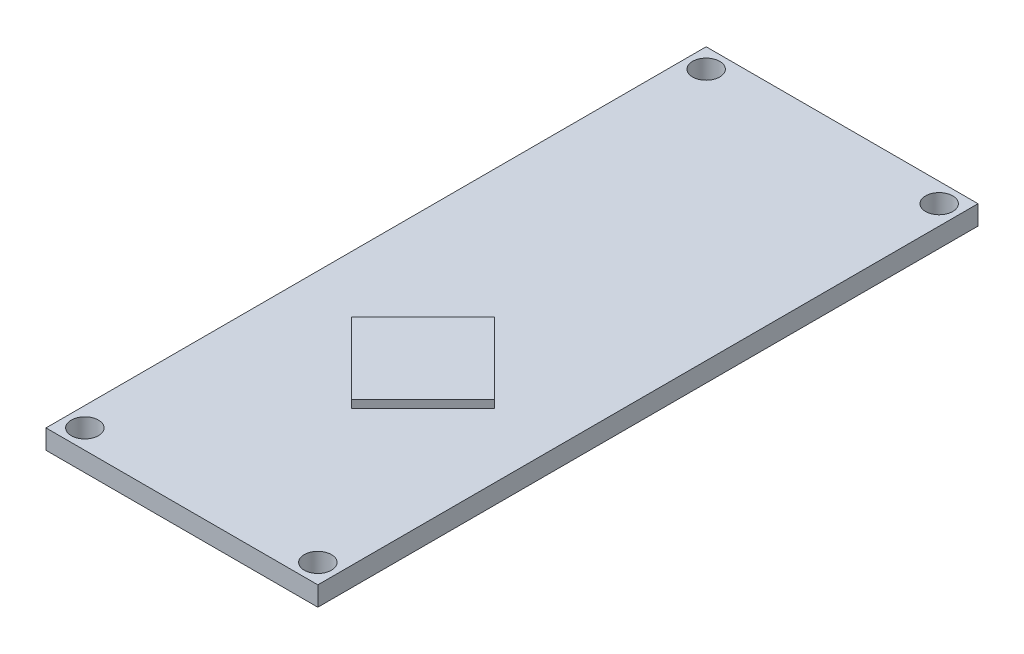
ISO-10303-21;
HEADER;
FILE_DESCRIPTION(('STEP AP214'),'2;1');
FILE_NAME('part.step','',(''),(''),'','','');
FILE_SCHEMA(('AUTOMOTIVE_DESIGN { 1 0 10303 214 1 1 1 1 }'));
ENDSEC;
DATA;
#1=APPLICATION_CONTEXT('core data for automotive mechanical design processes');
#2=APPLICATION_PROTOCOL_DEFINITION('international standard','automotive_design',2000,#1);
#3=PRODUCT_CONTEXT('',#1,'mechanical');
#4=PRODUCT('Part','Part','',(#3));
#5=PRODUCT_RELATED_PRODUCT_CATEGORY('part','',(#4));
#6=PRODUCT_DEFINITION_FORMATION('','',#4);
#7=PRODUCT_DEFINITION_CONTEXT('part definition',#1,'design');
#8=PRODUCT_DEFINITION('design','',#6,#7);
#9=PRODUCT_DEFINITION_SHAPE('','',#8);
#10=(LENGTH_UNIT() NAMED_UNIT(*) SI_UNIT(.MILLI.,.METRE.));
#11=(NAMED_UNIT(*) PLANE_ANGLE_UNIT() SI_UNIT($,.RADIAN.));
#12=(NAMED_UNIT(*) SI_UNIT($,.STERADIAN.) SOLID_ANGLE_UNIT());
#13=UNCERTAINTY_MEASURE_WITH_UNIT(LENGTH_MEASURE(1.E-05),#10,'distance_accuracy_value','');
#14=(GEOMETRIC_REPRESENTATION_CONTEXT(3) GLOBAL_UNCERTAINTY_ASSIGNED_CONTEXT((#13)) GLOBAL_UNIT_ASSIGNED_CONTEXT((#10,
#11,#12)) REPRESENTATION_CONTEXT('',''));
#15=CARTESIAN_POINT('',(0.,0.,0.));
#16=DIRECTION('',(0.,0.,1.));
#17=DIRECTION('',(1.,0.,0.));
#18=AXIS2_PLACEMENT_3D('',#15,#16,#17);
#19=CARTESIAN_POINT('',(0.,-0.508,0.));
#20=DIRECTION('',(0.,-1.,0.));
#21=DIRECTION('',(0.,0.,-1.));
#22=AXIS2_PLACEMENT_3D('',#19,#20,#21);
#23=PLANE('',#22);
#24=DIRECTION('',(0.,0.,-1.));
#25=VECTOR('',#24,1.);
#26=CARTESIAN_POINT('',(5.50663911064166,-0.508,-10.114599275795));
#27=LINE('',#26,#25);
#28=CARTESIAN_POINT('',(5.50663911064166,-0.508,-10.114599275795));
#29=VERTEX_POINT('',#28);
#30=CARTESIAN_POINT('',(5.50663911064166,-0.508,-13.018407240233));
#31=VERTEX_POINT('',#30);
#32=EDGE_CURVE('E130',#29,#31,#27,.T.);
#33=ORIENTED_EDGE('',*,*,#32,.F.);
#34=DIRECTION('',(1.,0.,0.));
#35=VECTOR('',#34,1.);
#36=CARTESIAN_POINT('',(-0.500613615789437,-0.508,-10.114599275795));
#37=LINE('',#36,#35);
#38=CARTESIAN_POINT('',(-0.500613615789437,-0.508,-10.114599275795));
#39=VERTEX_POINT('',#38);
#40=EDGE_CURVE('E127',#39,#29,#37,.T.);
#41=ORIENTED_EDGE('',*,*,#40,.F.);
#42=DIRECTION('',(0.,0.,1.));
#43=VECTOR('',#42,1.);
#44=CARTESIAN_POINT('',(-0.500613615789437,-0.508,-10.114599275795));
#45=LINE('',#44,#43);
#46=CARTESIAN_POINT('',(-0.500613615789437,-0.508,-13.018407240233));
#47=VERTEX_POINT('',#46);
#48=EDGE_CURVE('E144',#47,#39,#45,.T.);
#49=ORIENTED_EDGE('',*,*,#48,.F.);
#50=DIRECTION('',(-1.,0.,0.));
#51=VECTOR('',#50,1.);
#52=CARTESIAN_POINT('',(-0.500613615789437,-0.508,-13.018407240233));
#53=LINE('',#52,#51);
#54=EDGE_CURVE('E133',#31,#47,#53,.T.);
#55=ORIENTED_EDGE('',*,*,#54,.F.);
#56=EDGE_LOOP('',(#33,#41,#49,#55));
#57=FACE_BOUND('',#56,.T.);
#58=ADVANCED_FACE('F16',(#57),#23,.T.);
#59=CARTESIAN_POINT('',(0.,-0.508,0.));
#60=DIRECTION('',(0.,-1.,0.));
#61=DIRECTION('',(0.,0.,-1.));
#62=AXIS2_PLACEMENT_3D('',#59,#60,#61);
#63=PLANE('',#62);
#64=DIRECTION('',(0.,0.,-1.));
#65=VECTOR('',#64,1.);
#66=CARTESIAN_POINT('',(2.53466996138324,-0.508,16.2318082517412));
#67=LINE('',#66,#65);
#68=CARTESIAN_POINT('',(2.53466996138324,-0.508,16.2318082517412));
#69=VERTEX_POINT('',#68);
#70=CARTESIAN_POINT('',(2.53466996138324,-0.508,6.31387003138477));
#71=VERTEX_POINT('',#70);
#72=EDGE_CURVE('E228',#69,#71,#67,.T.);
#73=ORIENTED_EDGE('',*,*,#72,.F.);
#74=DIRECTION('',(1.,0.,0.));
#75=VECTOR('',#74,1.);
#76=CARTESIAN_POINT('',(-2.36452259621594,-0.508,16.2318082517412));
#77=LINE('',#76,#75);
#78=CARTESIAN_POINT('',(-2.36452259621594,-0.508,16.2318082517412));
#79=VERTEX_POINT('',#78);
#80=EDGE_CURVE('E225',#79,#69,#77,.T.);
#81=ORIENTED_EDGE('',*,*,#80,.F.);
#82=DIRECTION('',(0.,0.,1.));
#83=VECTOR('',#82,1.);
#84=CARTESIAN_POINT('',(-2.36452259621594,-0.508,16.2318082517412));
#85=LINE('',#84,#83);
#86=CARTESIAN_POINT('',(-2.36452259621594,-0.508,6.31387003138477));
#87=VERTEX_POINT('',#86);
#88=EDGE_CURVE('E219',#87,#79,#85,.T.);
#89=ORIENTED_EDGE('',*,*,#88,.F.);
#90=DIRECTION('',(-1.,0.,0.));
#91=VECTOR('',#90,1.);
#92=CARTESIAN_POINT('',(-2.36452259621594,-0.508,6.31387003138477));
#93=LINE('',#92,#91);
#94=EDGE_CURVE('E211',#71,#87,#93,.T.);
#95=ORIENTED_EDGE('',*,*,#94,.F.);
#96=EDGE_LOOP('',(#73,#81,#89,#95));
#97=FACE_BOUND('',#96,.T.);
#98=ADVANCED_FACE('F489',(#97),#63,.T.);
#99=CARTESIAN_POINT('',(5.50663911064166,-0.508,-10.114599275795));
#100=DIRECTION('',(1.,0.,0.));
#101=DIRECTION('',(0.,0.,-1.));
#102=AXIS2_PLACEMENT_3D('',#99,#100,#101);
#103=PLANE('',#102);
#104=ORIENTED_EDGE('',*,*,#32,.T.);
#105=DIRECTION('',(0.,1.,0.));
#106=VECTOR('',#105,1.);
#107=CARTESIAN_POINT('',(5.50663911064166,-0.508,-13.018407240233));
#108=LINE('',#107,#106);
#109=CARTESIAN_POINT('',(5.50663911064166,0.,-13.018407240233));
#110=VERTEX_POINT('',#109);
#111=EDGE_CURVE('E234',#110,#31,#108,.F.);
#112=ORIENTED_EDGE('',*,*,#111,.F.);
#113=DIRECTION('',(0.,0.,1.));
#114=VECTOR('',#113,1.);
#115=CARTESIAN_POINT('',(5.50663911064166,0.,0.));
#116=LINE('',#115,#114);
#117=CARTESIAN_POINT('',(5.50663911064166,0.,-10.114599275795));
#118=VERTEX_POINT('',#117);
#119=EDGE_CURVE('E141',#110,#118,#116,.T.);
#120=ORIENTED_EDGE('',*,*,#119,.T.);
#121=DIRECTION('',(0.,1.,0.));
#122=VECTOR('',#121,1.);
#123=CARTESIAN_POINT('',(5.50663911064166,-0.508,-10.114599275795));
#124=LINE('',#123,#122);
#125=EDGE_CURVE('E138',#29,#118,#124,.T.);
#126=ORIENTED_EDGE('',*,*,#125,.F.);
#127=EDGE_LOOP('',(#104,#112,#120,#126));
#128=FACE_BOUND('',#127,.T.);
#129=ADVANCED_FACE('F139',(#128),#103,.T.);
#130=CARTESIAN_POINT('',(-0.500613615789437,-0.508,-10.114599275795));
#131=DIRECTION('',(0.,0.,1.));
#132=DIRECTION('',(1.,0.,0.));
#133=AXIS2_PLACEMENT_3D('',#130,#131,#132);
#134=PLANE('',#133);
#135=ORIENTED_EDGE('',*,*,#40,.T.);
#136=ORIENTED_EDGE('',*,*,#125,.T.);
#137=DIRECTION('',(1.,0.,0.));
#138=VECTOR('',#137,1.);
#139=CARTESIAN_POINT('',(0.,0.,-10.114599275795));
#140=LINE('',#139,#138);
#141=CARTESIAN_POINT('',(-0.500613615789437,0.,-10.114599275795));
#142=VERTEX_POINT('',#141);
#143=EDGE_CURVE('E206',#118,#142,#140,.F.);
#144=ORIENTED_EDGE('',*,*,#143,.T.);
#145=DIRECTION('',(0.,1.,0.));
#146=VECTOR('',#145,1.);
#147=CARTESIAN_POINT('',(-0.500613615789437,-0.508,-10.114599275795));
#148=LINE('',#147,#146);
#149=EDGE_CURVE('E148',#39,#142,#148,.T.);
#150=ORIENTED_EDGE('',*,*,#149,.F.);
#151=EDGE_LOOP('',(#135,#136,#144,#150));
#152=FACE_BOUND('',#151,.T.);
#153=ADVANCED_FACE('F146',(#152),#134,.T.);
#154=CARTESIAN_POINT('',(-0.500613615789437,-0.508,-10.114599275795));
#155=DIRECTION('',(-1.,0.,0.));
#156=DIRECTION('',(0.,0.,1.));
#157=AXIS2_PLACEMENT_3D('',#154,#155,#156);
#158=PLANE('',#157);
#159=ORIENTED_EDGE('',*,*,#48,.T.);
#160=ORIENTED_EDGE('',*,*,#149,.T.);
#161=DIRECTION('',(0.,0.,1.));
#162=VECTOR('',#161,1.);
#163=CARTESIAN_POINT('',(-0.500613615789437,0.,0.));
#164=LINE('',#163,#162);
#165=CARTESIAN_POINT('',(-0.500613615789437,0.,-13.018407240233));
#166=VERTEX_POINT('',#165);
#167=EDGE_CURVE('E204',#142,#166,#164,.F.);
#168=ORIENTED_EDGE('',*,*,#167,.T.);
#169=DIRECTION('',(0.,1.,0.));
#170=VECTOR('',#169,1.);
#171=CARTESIAN_POINT('',(-0.500613615789437,-0.508,-13.018407240233));
#172=LINE('',#171,#170);
#173=EDGE_CURVE('E230',#47,#166,#172,.T.);
#174=ORIENTED_EDGE('',*,*,#173,.F.);
#175=EDGE_LOOP('',(#159,#160,#168,#174));
#176=FACE_BOUND('',#175,.T.);
#177=ADVANCED_FACE('F238',(#176),#158,.T.);
#178=CARTESIAN_POINT('',(-0.500613615789437,-0.508,-13.018407240233));
#179=DIRECTION('',(0.,0.,-1.));
#180=DIRECTION('',(-1.,0.,0.));
#181=AXIS2_PLACEMENT_3D('',#178,#179,#180);
#182=PLANE('',#181);
#183=ORIENTED_EDGE('',*,*,#54,.T.);
#184=ORIENTED_EDGE('',*,*,#173,.T.);
#185=DIRECTION('',(1.,0.,0.));
#186=VECTOR('',#185,1.);
#187=CARTESIAN_POINT('',(0.,0.,-13.018407240233));
#188=LINE('',#187,#186);
#189=EDGE_CURVE('E201',#166,#110,#188,.T.);
#190=ORIENTED_EDGE('',*,*,#189,.T.);
#191=ORIENTED_EDGE('',*,*,#111,.T.);
#192=EDGE_LOOP('',(#183,#184,#190,#191));
#193=FACE_BOUND('',#192,.T.);
#194=ADVANCED_FACE('F242',(#193),#182,.T.);
#195=CARTESIAN_POINT('',(2.53466996138324,-0.508,16.2318082517412));
#196=DIRECTION('',(1.,0.,0.));
#197=DIRECTION('',(0.,0.,-1.));
#198=AXIS2_PLACEMENT_3D('',#195,#196,#197);
#199=PLANE('',#198);
#200=ORIENTED_EDGE('',*,*,#72,.T.);
#201=DIRECTION('',(0.,1.,0.));
#202=VECTOR('',#201,1.);
#203=CARTESIAN_POINT('',(2.53466996138324,-0.508,6.31387003138477));
#204=LINE('',#203,#202);
#205=CARTESIAN_POINT('',(2.53466996138324,0.,6.31387003138477));
#206=VERTEX_POINT('',#205);
#207=EDGE_CURVE('E214',#206,#71,#204,.F.);
#208=ORIENTED_EDGE('',*,*,#207,.F.);
#209=DIRECTION('',(0.,0.,1.));
#210=VECTOR('',#209,1.);
#211=CARTESIAN_POINT('',(2.53466996138324,0.,0.));
#212=LINE('',#211,#210);
#213=CARTESIAN_POINT('',(2.53466996138324,0.,16.2318082517412));
#214=VERTEX_POINT('',#213);
#215=EDGE_CURVE('E199',#206,#214,#212,.T.);
#216=ORIENTED_EDGE('',*,*,#215,.T.);
#217=DIRECTION('',(0.,1.,0.));
#218=VECTOR('',#217,1.);
#219=CARTESIAN_POINT('',(2.53466996138324,-0.508,16.2318082517412));
#220=LINE('',#219,#218);
#221=EDGE_CURVE('E222',#69,#214,#220,.T.);
#222=ORIENTED_EDGE('',*,*,#221,.F.);
#223=EDGE_LOOP('',(#200,#208,#216,#222));
#224=FACE_BOUND('',#223,.T.);
#225=ADVANCED_FACE('F446',(#224),#199,.T.);
#226=CARTESIAN_POINT('',(-2.36452259621594,-0.508,16.2318082517412));
#227=DIRECTION('',(0.,0.,1.));
#228=DIRECTION('',(1.,0.,0.));
#229=AXIS2_PLACEMENT_3D('',#226,#227,#228);
#230=PLANE('',#229);
#231=ORIENTED_EDGE('',*,*,#80,.T.);
#232=ORIENTED_EDGE('',*,*,#221,.T.);
#233=DIRECTION('',(1.,0.,0.));
#234=VECTOR('',#233,1.);
#235=CARTESIAN_POINT('',(0.,0.,16.2318082517412));
#236=LINE('',#235,#234);
#237=CARTESIAN_POINT('',(-2.36452259621594,0.,16.2318082517412));
#238=VERTEX_POINT('',#237);
#239=EDGE_CURVE('E194',#214,#238,#236,.F.);
#240=ORIENTED_EDGE('',*,*,#239,.T.);
#241=DIRECTION('',(0.,1.,0.));
#242=VECTOR('',#241,1.);
#243=CARTESIAN_POINT('',(-2.36452259621594,-0.508,16.2318082517412));
#244=LINE('',#243,#242);
#245=EDGE_CURVE('E216',#79,#238,#244,.T.);
#246=ORIENTED_EDGE('',*,*,#245,.F.);
#247=EDGE_LOOP('',(#231,#232,#240,#246));
#248=FACE_BOUND('',#247,.T.);
#249=ADVANCED_FACE('F436',(#248),#230,.T.);
#250=CARTESIAN_POINT('',(-2.36452259621594,-0.508,16.2318082517412));
#251=DIRECTION('',(-1.,0.,0.));
#252=DIRECTION('',(0.,0.,1.));
#253=AXIS2_PLACEMENT_3D('',#250,#251,#252);
#254=PLANE('',#253);
#255=ORIENTED_EDGE('',*,*,#88,.T.);
#256=ORIENTED_EDGE('',*,*,#245,.T.);
#257=DIRECTION('',(0.,0.,1.));
#258=VECTOR('',#257,1.);
#259=CARTESIAN_POINT('',(-2.36452259621594,0.,0.));
#260=LINE('',#259,#258);
#261=CARTESIAN_POINT('',(-2.36452259621594,0.,6.31387003138477));
#262=VERTEX_POINT('',#261);
#263=EDGE_CURVE('E187',#238,#262,#260,.F.);
#264=ORIENTED_EDGE('',*,*,#263,.T.);
#265=DIRECTION('',(0.,1.,0.));
#266=VECTOR('',#265,1.);
#267=CARTESIAN_POINT('',(-2.36452259621594,-0.508,6.31387003138477));
#268=LINE('',#267,#266);
#269=EDGE_CURVE('E209',#87,#262,#268,.T.);
#270=ORIENTED_EDGE('',*,*,#269,.F.);
#271=EDGE_LOOP('',(#255,#256,#264,#270));
#272=FACE_BOUND('',#271,.T.);
#273=ADVANCED_FACE('F258',(#272),#254,.T.);
#274=CARTESIAN_POINT('',(-2.36452259621594,-0.508,6.31387003138477));
#275=DIRECTION('',(0.,0.,-1.));
#276=DIRECTION('',(-1.,0.,0.));
#277=AXIS2_PLACEMENT_3D('',#274,#275,#276);
#278=PLANE('',#277);
#279=ORIENTED_EDGE('',*,*,#94,.T.);
#280=ORIENTED_EDGE('',*,*,#269,.T.);
#281=DIRECTION('',(1.,0.,0.));
#282=VECTOR('',#281,1.);
#283=CARTESIAN_POINT('',(0.,0.,6.31387003138477));
#284=LINE('',#283,#282);
#285=EDGE_CURVE('E183',#262,#206,#284,.T.);
#286=ORIENTED_EDGE('',*,*,#285,.T.);
#287=ORIENTED_EDGE('',*,*,#207,.T.);
#288=EDGE_LOOP('',(#279,#280,#286,#287));
#289=FACE_BOUND('',#288,.T.);
#290=ADVANCED_FACE('F247',(#289),#278,.T.);
#291=CARTESIAN_POINT('',(0.,0.,0.));
#292=DIRECTION('',(0.,1.,0.));
#293=DIRECTION('',(0.,0.,1.));
#294=AXIS2_PLACEMENT_3D('',#291,#292,#293);
#295=PLANE('',#294);
#296=CARTESIAN_POINT('',(7.62,0.,20.32));
#297=DIRECTION('',(0.,-1.,0.));
#298=DIRECTION('',(0.,0.,-1.));
#299=AXIS2_PLACEMENT_3D('',#296,#297,#298);
#300=CIRCLE('',#299,0.889000000000001);
#301=CARTESIAN_POINT('',(7.62,0.,19.431));
#302=VERTEX_POINT('',#301);
#303=EDGE_CURVE('E168',#302,#302,#300,.F.);
#304=ORIENTED_EDGE('',*,*,#303,.T.);
#305=EDGE_LOOP('',(#304));
#306=FACE_BOUND('',#305,.T.);
#307=CARTESIAN_POINT('',(-7.62,0.,-20.32));
#308=DIRECTION('',(0.,-1.,0.));
#309=DIRECTION('',(0.,0.,-1.));
#310=AXIS2_PLACEMENT_3D('',#307,#308,#309);
#311=CIRCLE('',#310,0.889000000000001);
#312=CARTESIAN_POINT('',(-7.62,0.,-21.209));
#313=VERTEX_POINT('',#312);
#314=EDGE_CURVE('E172',#313,#313,#311,.F.);
#315=ORIENTED_EDGE('',*,*,#314,.T.);
#316=EDGE_LOOP('',(#315));
#317=FACE_BOUND('',#316,.T.);
#318=DIRECTION('',(1.,0.,0.));
#319=VECTOR('',#318,1.);
#320=CARTESIAN_POINT('',(8.89,0.,-21.59));
#321=LINE('',#320,#319);
#322=CARTESIAN_POINT('',(-8.89,0.,-21.59));
#323=VERTEX_POINT('',#322);
#324=CARTESIAN_POINT('',(8.89,0.,-21.59));
#325=VERTEX_POINT('',#324);
#326=EDGE_CURVE('E174',#323,#325,#321,.T.);
#327=ORIENTED_EDGE('',*,*,#326,.T.);
#328=DIRECTION('',(0.,0.,1.));
#329=VECTOR('',#328,1.);
#330=CARTESIAN_POINT('',(8.89,0.,21.59));
#331=LINE('',#330,#329);
#332=CARTESIAN_POINT('',(8.89,0.,21.59));
#333=VERTEX_POINT('',#332);
#334=EDGE_CURVE('E584',#325,#333,#331,.T.);
#335=ORIENTED_EDGE('',*,*,#334,.T.);
#336=DIRECTION('',(-1.,0.,0.));
#337=VECTOR('',#336,1.);
#338=CARTESIAN_POINT('',(8.89,0.,21.59));
#339=LINE('',#338,#337);
#340=CARTESIAN_POINT('',(-8.89,0.,21.59));
#341=VERTEX_POINT('',#340);
#342=EDGE_CURVE('E548',#333,#341,#339,.T.);
#343=ORIENTED_EDGE('',*,*,#342,.T.);
#344=DIRECTION('',(0.,0.,-1.));
#345=VECTOR('',#344,1.);
#346=CARTESIAN_POINT('',(-8.89,0.,21.59));
#347=LINE('',#346,#345);
#348=EDGE_CURVE('E177',#341,#323,#347,.T.);
#349=ORIENTED_EDGE('',*,*,#348,.T.);
#350=EDGE_LOOP('',(#327,#335,#343,#349));
#351=FACE_BOUND('',#350,.T.);
#352=CARTESIAN_POINT('',(7.62,0.,-20.32));
#353=DIRECTION('',(0.,-1.,0.));
#354=DIRECTION('',(0.,0.,-1.));
#355=AXIS2_PLACEMENT_3D('',#352,#353,#354);
#356=CIRCLE('',#355,0.889000000000001);
#357=CARTESIAN_POINT('',(7.62,0.,-21.209));
#358=VERTEX_POINT('',#357);
#359=EDGE_CURVE('E175',#358,#358,#356,.F.);
#360=ORIENTED_EDGE('',*,*,#359,.T.);
#361=EDGE_LOOP('',(#360));
#362=FACE_BOUND('',#361,.T.);
#363=CARTESIAN_POINT('',(-7.62,0.,20.32));
#364=DIRECTION('',(0.,-1.,0.));
#365=DIRECTION('',(0.,0.,-1.));
#366=AXIS2_PLACEMENT_3D('',#363,#364,#365);
#367=CIRCLE('',#366,0.889000000000001);
#368=CARTESIAN_POINT('',(-7.62,0.,19.431));
#369=VERTEX_POINT('',#368);
#370=EDGE_CURVE('E19',#369,#369,#367,.F.);
#371=ORIENTED_EDGE('',*,*,#370,.T.);
#372=EDGE_LOOP('',(#371));
#373=FACE_BOUND('',#372,.T.);
#374=ORIENTED_EDGE('',*,*,#263,.F.);
#375=ORIENTED_EDGE('',*,*,#239,.F.);
#376=ORIENTED_EDGE('',*,*,#215,.F.);
#377=ORIENTED_EDGE('',*,*,#285,.F.);
#378=EDGE_LOOP('',(#374,#375,#376,#377));
#379=FACE_BOUND('',#378,.T.);
#380=ORIENTED_EDGE('',*,*,#167,.F.);
#381=ORIENTED_EDGE('',*,*,#143,.F.);
#382=ORIENTED_EDGE('',*,*,#119,.F.);
#383=ORIENTED_EDGE('',*,*,#189,.F.);
#384=EDGE_LOOP('',(#380,#381,#382,#383));
#385=FACE_BOUND('',#384,.T.);
#386=ADVANCED_FACE('F244',(#306,#317,#351,#362,#373,#379,#385),#295,.F.);
#387=CARTESIAN_POINT('',(0.,1.778,0.));
#388=DIRECTION('',(0.,-1.,0.));
#389=DIRECTION('',(0.,0.,-1.));
#390=AXIS2_PLACEMENT_3D('',#387,#388,#389);
#391=PLANE('',#390);
#392=DIRECTION('',(-0.707106781186547,0.,0.707106781186548));
#393=VECTOR('',#392,1.);
#394=CARTESIAN_POINT('',(0.,1.778,10.4962324631941));
#395=LINE('',#394,#393);
#396=CARTESIAN_POINT('',(0.,1.778,10.4962324631941));
#397=VERTEX_POINT('',#396);
#398=CARTESIAN_POINT('',(4.66828603634607,1.778,5.82794642684803));
#399=VERTEX_POINT('',#398);
#400=EDGE_CURVE('E171',#397,#399,#395,.F.);
#401=ORIENTED_EDGE('',*,*,#400,.T.);
#402=DIRECTION('',(0.707106781186548,0.,0.707106781186547));
#403=VECTOR('',#402,1.);
#404=CARTESIAN_POINT('',(4.66828603634607,1.778,5.82794642684803));
#405=LINE('',#404,#403);
#406=CARTESIAN_POINT('',(0.,1.778,1.15966039050197));
#407=VERTEX_POINT('',#406);
#408=EDGE_CURVE('E564',#399,#407,#405,.F.);
#409=ORIENTED_EDGE('',*,*,#408,.T.);
#410=DIRECTION('',(0.707106781186548,0.,-0.707106781186547));
#411=VECTOR('',#410,1.);
#412=CARTESIAN_POINT('',(-4.66828603634606,1.778,5.82794642684803));
#413=LINE('',#412,#411);
#414=CARTESIAN_POINT('',(-4.66828603634606,1.778,5.82794642684803));
#415=VERTEX_POINT('',#414);
#416=EDGE_CURVE('E571',#407,#415,#413,.F.);
#417=ORIENTED_EDGE('',*,*,#416,.T.);
#418=DIRECTION('',(-0.707106781186548,0.,-0.707106781186547));
#419=VECTOR('',#418,1.);
#420=CARTESIAN_POINT('',(0.,1.778,10.4962324631941));
#421=LINE('',#420,#419);
#422=EDGE_CURVE('E575',#415,#397,#421,.F.);
#423=ORIENTED_EDGE('',*,*,#422,.T.);
#424=EDGE_LOOP('',(#401,#409,#417,#423));
#425=FACE_BOUND('',#424,.T.);
#426=ADVANCED_FACE('F246',(#425),#391,.F.);
#427=CARTESIAN_POINT('',(-7.62,1.271,20.32));
#428=DIRECTION('',(0.,-1.,0.));
#429=DIRECTION('',(0.,0.,-1.));
#430=AXIS2_PLACEMENT_3D('',#427,#428,#429);
#431=CYLINDRICAL_SURFACE('',#430,0.889000000000001);
#432=CARTESIAN_POINT('',(-7.62,1.27,20.32));
#433=DIRECTION('',(0.,-1.,0.));
#434=DIRECTION('',(0.,0.,-1.));
#435=AXIS2_PLACEMENT_3D('',#432,#433,#434);
#436=CIRCLE('',#435,0.889000000000001);
#437=CARTESIAN_POINT('',(-7.62,1.27,19.431));
#438=VERTEX_POINT('',#437);
#439=EDGE_CURVE('E165',#438,#438,#436,.T.);
#440=ORIENTED_EDGE('',*,*,#439,.F.);
#441=EDGE_LOOP('',(#440));
#442=FACE_BOUND('',#441,.T.);
#443=ORIENTED_EDGE('',*,*,#370,.F.);
#444=EDGE_LOOP('',(#443));
#445=FACE_BOUND('',#444,.T.);
#446=ADVANCED_FACE('F255',(#442,#445),#431,.F.);
#447=CARTESIAN_POINT('',(7.62,1.271,-20.32));
#448=DIRECTION('',(0.,-1.,0.));
#449=DIRECTION('',(0.,0.,-1.));
#450=AXIS2_PLACEMENT_3D('',#447,#448,#449);
#451=CYLINDRICAL_SURFACE('',#450,0.889000000000001);
#452=CARTESIAN_POINT('',(7.62,1.27,-20.32));
#453=DIRECTION('',(0.,-1.,0.));
#454=DIRECTION('',(0.,0.,-1.));
#455=AXIS2_PLACEMENT_3D('',#452,#453,#454);
#456=CIRCLE('',#455,0.889000000000001);
#457=CARTESIAN_POINT('',(7.62,1.27,-21.209));
#458=VERTEX_POINT('',#457);
#459=EDGE_CURVE('E161',#458,#458,#456,.T.);
#460=ORIENTED_EDGE('',*,*,#459,.F.);
#461=EDGE_LOOP('',(#460));
#462=FACE_BOUND('',#461,.T.);
#463=ORIENTED_EDGE('',*,*,#359,.F.);
#464=EDGE_LOOP('',(#463));
#465=FACE_BOUND('',#464,.T.);
#466=ADVANCED_FACE('F308',(#462,#465),#451,.F.);
#467=CARTESIAN_POINT('',(-8.89,1.27,21.59));
#468=DIRECTION('',(1.,0.,0.));
#469=DIRECTION('',(0.,0.,-1.));
#470=AXIS2_PLACEMENT_3D('',#467,#468,#469);
#471=PLANE('',#470);
#472=DIRECTION('',(0.,1.,0.));
#473=VECTOR('',#472,1.);
#474=CARTESIAN_POINT('',(-8.89,1.27,21.59));
#475=LINE('',#474,#473);
#476=CARTESIAN_POINT('',(-8.89,1.27,21.59));
#477=VERTEX_POINT('',#476);
#478=EDGE_CURVE('E180',#341,#477,#475,.T.);
#479=ORIENTED_EDGE('',*,*,#478,.T.);
#480=DIRECTION('',(0.,0.,1.));
#481=VECTOR('',#480,1.);
#482=CARTESIAN_POINT('',(-8.89,1.27,0.));
#483=LINE('',#482,#481);
#484=CARTESIAN_POINT('',(-8.89,1.27,-21.59));
#485=VERTEX_POINT('',#484);
#486=EDGE_CURVE('E164',#485,#477,#483,.T.);
#487=ORIENTED_EDGE('',*,*,#486,.F.);
#488=DIRECTION('',(0.,1.,0.));
#489=VECTOR('',#488,1.);
#490=CARTESIAN_POINT('',(-8.89,1.27,-21.59));
#491=LINE('',#490,#489);
#492=EDGE_CURVE('E580',#485,#323,#491,.F.);
#493=ORIENTED_EDGE('',*,*,#492,.T.);
#494=ORIENTED_EDGE('',*,*,#348,.F.);
#495=EDGE_LOOP('',(#479,#487,#493,#494));
#496=FACE_BOUND('',#495,.T.);
#497=ADVANCED_FACE('F304',(#496),#471,.F.);
#498=CARTESIAN_POINT('',(8.89,1.27,21.59));
#499=DIRECTION('',(0.,0.,-1.));
#500=DIRECTION('',(-1.,0.,0.));
#501=AXIS2_PLACEMENT_3D('',#498,#499,#500);
#502=PLANE('',#501);
#503=DIRECTION('',(0.,1.,0.));
#504=VECTOR('',#503,1.);
#505=CARTESIAN_POINT('',(8.89,1.27,21.59));
#506=LINE('',#505,#504);
#507=CARTESIAN_POINT('',(8.89,1.27,21.59));
#508=VERTEX_POINT('',#507);
#509=EDGE_CURVE('E552',#333,#508,#506,.T.);
#510=ORIENTED_EDGE('',*,*,#509,.T.);
#511=DIRECTION('',(1.,0.,0.));
#512=VECTOR('',#511,1.);
#513=CARTESIAN_POINT('',(0.,1.27,21.59));
#514=LINE('',#513,#512);
#515=EDGE_CURVE('E550',#477,#508,#514,.T.);
#516=ORIENTED_EDGE('',*,*,#515,.F.);
#517=ORIENTED_EDGE('',*,*,#478,.F.);
#518=ORIENTED_EDGE('',*,*,#342,.F.);
#519=EDGE_LOOP('',(#510,#516,#517,#518));
#520=FACE_BOUND('',#519,.T.);
#521=ADVANCED_FACE('F300',(#520),#502,.F.);
#522=CARTESIAN_POINT('',(8.89,1.27,21.59));
#523=DIRECTION('',(-1.,0.,0.));
#524=DIRECTION('',(0.,0.,1.));
#525=AXIS2_PLACEMENT_3D('',#522,#523,#524);
#526=PLANE('',#525);
#527=DIRECTION('',(0.,1.,0.));
#528=VECTOR('',#527,1.);
#529=CARTESIAN_POINT('',(8.89,1.27,-21.59));
#530=LINE('',#529,#528);
#531=CARTESIAN_POINT('',(8.89,1.27,-21.59));
#532=VERTEX_POINT('',#531);
#533=EDGE_CURVE('E582',#325,#532,#530,.T.);
#534=ORIENTED_EDGE('',*,*,#533,.T.);
#535=DIRECTION('',(0.,0.,1.));
#536=VECTOR('',#535,1.);
#537=CARTESIAN_POINT('',(8.89,1.27,0.));
#538=LINE('',#537,#536);
#539=EDGE_CURVE('E556',#508,#532,#538,.F.);
#540=ORIENTED_EDGE('',*,*,#539,.F.);
#541=ORIENTED_EDGE('',*,*,#509,.F.);
#542=ORIENTED_EDGE('',*,*,#334,.F.);
#543=EDGE_LOOP('',(#534,#540,#541,#542));
#544=FACE_BOUND('',#543,.T.);
#545=ADVANCED_FACE('F296',(#544),#526,.F.);
#546=CARTESIAN_POINT('',(8.89,1.27,-21.59));
#547=DIRECTION('',(0.,0.,1.));
#548=DIRECTION('',(1.,0.,0.));
#549=AXIS2_PLACEMENT_3D('',#546,#547,#548);
#550=PLANE('',#549);
#551=ORIENTED_EDGE('',*,*,#492,.F.);
#552=DIRECTION('',(1.,0.,0.));
#553=VECTOR('',#552,1.);
#554=CARTESIAN_POINT('',(0.,1.27,-21.59));
#555=LINE('',#554,#553);
#556=EDGE_CURVE('E160',#532,#485,#555,.F.);
#557=ORIENTED_EDGE('',*,*,#556,.F.);
#558=ORIENTED_EDGE('',*,*,#533,.F.);
#559=ORIENTED_EDGE('',*,*,#326,.F.);
#560=EDGE_LOOP('',(#551,#557,#558,#559));
#561=FACE_BOUND('',#560,.T.);
#562=ADVANCED_FACE('F292',(#561),#550,.F.);
#563=CARTESIAN_POINT('',(-7.62,1.271,-20.32));
#564=DIRECTION('',(0.,-1.,0.));
#565=DIRECTION('',(0.,0.,-1.));
#566=AXIS2_PLACEMENT_3D('',#563,#564,#565);
#567=CYLINDRICAL_SURFACE('',#566,0.889000000000001);
#568=CARTESIAN_POINT('',(-7.62,1.27,-20.32));
#569=DIRECTION('',(0.,-1.,0.));
#570=DIRECTION('',(0.,0.,-1.));
#571=AXIS2_PLACEMENT_3D('',#568,#569,#570);
#572=CIRCLE('',#571,0.889000000000001);
#573=CARTESIAN_POINT('',(-7.62,1.27,-21.209));
#574=VERTEX_POINT('',#573);
#575=EDGE_CURVE('E157',#574,#574,#572,.T.);
#576=ORIENTED_EDGE('',*,*,#575,.F.);
#577=EDGE_LOOP('',(#576));
#578=FACE_BOUND('',#577,.T.);
#579=ORIENTED_EDGE('',*,*,#314,.F.);
#580=EDGE_LOOP('',(#579));
#581=FACE_BOUND('',#580,.T.);
#582=ADVANCED_FACE('F288',(#578,#581),#567,.F.);
#583=CARTESIAN_POINT('',(7.62,1.271,20.32));
#584=DIRECTION('',(0.,-1.,0.));
#585=DIRECTION('',(0.,0.,-1.));
#586=AXIS2_PLACEMENT_3D('',#583,#584,#585);
#587=CYLINDRICAL_SURFACE('',#586,0.889000000000001);
#588=CARTESIAN_POINT('',(7.62,1.27,20.32));
#589=DIRECTION('',(0.,-1.,0.));
#590=DIRECTION('',(0.,0.,-1.));
#591=AXIS2_PLACEMENT_3D('',#588,#589,#590);
#592=CIRCLE('',#591,0.889000000000001);
#593=CARTESIAN_POINT('',(7.62,1.27,19.431));
#594=VERTEX_POINT('',#593);
#595=EDGE_CURVE('E153',#594,#594,#592,.T.);
#596=ORIENTED_EDGE('',*,*,#595,.F.);
#597=EDGE_LOOP('',(#596));
#598=FACE_BOUND('',#597,.T.);
#599=ORIENTED_EDGE('',*,*,#303,.F.);
#600=EDGE_LOOP('',(#599));
#601=FACE_BOUND('',#600,.T.);
#602=ADVANCED_FACE('F284',(#598,#601),#587,.F.);
#603=CARTESIAN_POINT('',(0.,1.778,10.4962324631941));
#604=DIRECTION('',(-0.707106781186548,0.,-0.707106781186547));
#605=DIRECTION('',(-0.707106781186547,0.,0.707106781186548));
#606=AXIS2_PLACEMENT_3D('',#603,#604,#605);
#607=PLANE('',#606);
#608=DIRECTION('',(0.,1.,0.));
#609=VECTOR('',#608,1.);
#610=CARTESIAN_POINT('',(4.66828603634607,1.778,5.82794642684803));
#611=LINE('',#610,#609);
#612=CARTESIAN_POINT('',(4.66828603634607,1.27,5.82794642684803));
#613=VERTEX_POINT('',#612);
#614=EDGE_CURVE('E566',#613,#399,#611,.T.);
#615=ORIENTED_EDGE('',*,*,#614,.T.);
#616=ORIENTED_EDGE('',*,*,#400,.F.);
#617=DIRECTION('',(0.,1.,0.));
#618=VECTOR('',#617,1.);
#619=CARTESIAN_POINT('',(0.,1.778,10.4962324631941));
#620=LINE('',#619,#618);
#621=CARTESIAN_POINT('',(0.,1.27,10.4962324631941));
#622=VERTEX_POINT('',#621);
#623=EDGE_CURVE('E573',#397,#622,#620,.F.);
#624=ORIENTED_EDGE('',*,*,#623,.T.);
#625=DIRECTION('',(-0.707106781186547,0.,0.707106781186548));
#626=VECTOR('',#625,1.);
#627=CARTESIAN_POINT('',(4.66828603634607,1.27,5.82794642684803));
#628=LINE('',#627,#626);
#629=EDGE_CURVE('E156',#613,#622,#628,.T.);
#630=ORIENTED_EDGE('',*,*,#629,.F.);
#631=EDGE_LOOP('',(#615,#616,#624,#630));
#632=FACE_BOUND('',#631,.T.);
#633=ADVANCED_FACE('F280',(#632),#607,.F.);
#634=CARTESIAN_POINT('',(0.,1.778,10.4962324631941));
#635=DIRECTION('',(0.707106781186547,0.,-0.707106781186548));
#636=DIRECTION('',(-0.707106781186548,0.,-0.707106781186547));
#637=AXIS2_PLACEMENT_3D('',#634,#635,#636);
#638=PLANE('',#637);
#639=ORIENTED_EDGE('',*,*,#623,.F.);
#640=ORIENTED_EDGE('',*,*,#422,.F.);
#641=DIRECTION('',(0.,1.,0.));
#642=VECTOR('',#641,1.);
#643=CARTESIAN_POINT('',(-4.66828603634606,1.778,5.82794642684803));
#644=LINE('',#643,#642);
#645=CARTESIAN_POINT('',(-4.66828603634606,1.27,5.82794642684803));
#646=VERTEX_POINT('',#645);
#647=EDGE_CURVE('E569',#415,#646,#644,.F.);
#648=ORIENTED_EDGE('',*,*,#647,.T.);
#649=DIRECTION('',(-0.707106781186548,0.,-0.707106781186547));
#650=VECTOR('',#649,1.);
#651=CARTESIAN_POINT('',(0.,1.27,10.4962324631941));
#652=LINE('',#651,#650);
#653=EDGE_CURVE('E595',#622,#646,#652,.T.);
#654=ORIENTED_EDGE('',*,*,#653,.F.);
#655=EDGE_LOOP('',(#639,#640,#648,#654));
#656=FACE_BOUND('',#655,.T.);
#657=ADVANCED_FACE('F277',(#656),#638,.F.);
#658=CARTESIAN_POINT('',(-4.66828603634606,1.778,5.82794642684803));
#659=DIRECTION('',(0.707106781186547,0.,0.707106781186548));
#660=DIRECTION('',(0.707106781186548,0.,-0.707106781186547));
#661=AXIS2_PLACEMENT_3D('',#658,#659,#660);
#662=PLANE('',#661);
#663=ORIENTED_EDGE('',*,*,#647,.F.);
#664=ORIENTED_EDGE('',*,*,#416,.F.);
#665=DIRECTION('',(0.,1.,0.));
#666=VECTOR('',#665,1.);
#667=CARTESIAN_POINT('',(0.,1.778,1.15966039050197));
#668=LINE('',#667,#666);
#669=CARTESIAN_POINT('',(0.,1.27,1.15966039050197));
#670=VERTEX_POINT('',#669);
#671=EDGE_CURVE('E34',#407,#670,#668,.F.);
#672=ORIENTED_EDGE('',*,*,#671,.T.);
#673=DIRECTION('',(0.707106781186548,0.,-0.707106781186548));
#674=VECTOR('',#673,1.);
#675=CARTESIAN_POINT('',(-4.66828603634606,1.27,5.82794642684803));
#676=LINE('',#675,#674);
#677=EDGE_CURVE('E25',#646,#670,#676,.T.);
#678=ORIENTED_EDGE('',*,*,#677,.F.);
#679=EDGE_LOOP('',(#663,#664,#672,#678));
#680=FACE_BOUND('',#679,.T.);
#681=ADVANCED_FACE('F269',(#680),#662,.F.);
#682=CARTESIAN_POINT('',(4.66828603634607,1.778,5.82794642684803));
#683=DIRECTION('',(-0.707106781186547,0.,0.707106781186548));
#684=DIRECTION('',(0.707106781186548,0.,0.707106781186547));
#685=AXIS2_PLACEMENT_3D('',#682,#683,#684);
#686=PLANE('',#685);
#687=ORIENTED_EDGE('',*,*,#671,.F.);
#688=ORIENTED_EDGE('',*,*,#408,.F.);
#689=ORIENTED_EDGE('',*,*,#614,.F.);
#690=DIRECTION('',(0.707106781186548,0.,0.707106781186547));
#691=VECTOR('',#690,1.);
#692=CARTESIAN_POINT('',(0.,1.27,1.15966039050197));
#693=LINE('',#692,#691);
#694=EDGE_CURVE('E11',#670,#613,#693,.T.);
#695=ORIENTED_EDGE('',*,*,#694,.F.);
#696=EDGE_LOOP('',(#687,#688,#689,#695));
#697=FACE_BOUND('',#696,.T.);
#698=ADVANCED_FACE('F263',(#697),#686,.F.);
#699=CARTESIAN_POINT('',(0.,1.27,0.));
#700=DIRECTION('',(0.,1.,0.));
#701=DIRECTION('',(0.,0.,1.));
#702=AXIS2_PLACEMENT_3D('',#699,#700,#701);
#703=PLANE('',#702);
#704=ORIENTED_EDGE('',*,*,#677,.T.);
#705=ORIENTED_EDGE('',*,*,#694,.T.);
#706=ORIENTED_EDGE('',*,*,#629,.T.);
#707=ORIENTED_EDGE('',*,*,#653,.T.);
#708=EDGE_LOOP('',(#704,#705,#706,#707));
#709=FACE_BOUND('',#708,.T.);
#710=ORIENTED_EDGE('',*,*,#595,.T.);
#711=EDGE_LOOP('',(#710));
#712=FACE_BOUND('',#711,.T.);
#713=ORIENTED_EDGE('',*,*,#575,.T.);
#714=EDGE_LOOP('',(#713));
#715=FACE_BOUND('',#714,.T.);
#716=ORIENTED_EDGE('',*,*,#539,.T.);
#717=ORIENTED_EDGE('',*,*,#556,.T.);
#718=ORIENTED_EDGE('',*,*,#486,.T.);
#719=ORIENTED_EDGE('',*,*,#515,.T.);
#720=EDGE_LOOP('',(#716,#717,#718,#719));
#721=FACE_BOUND('',#720,.T.);
#722=ORIENTED_EDGE('',*,*,#459,.T.);
#723=EDGE_LOOP('',(#722));
#724=FACE_BOUND('',#723,.T.);
#725=ORIENTED_EDGE('',*,*,#439,.T.);
#726=EDGE_LOOP('',(#725));
#727=FACE_BOUND('',#726,.T.);
#728=ADVANCED_FACE('F261',(#709,#712,#715,#721,#724,#727),#703,.T.);
#729=CLOSED_SHELL('',(#58,#98,#129,#153,#177,#194,#225,#249,#273,#290,#386,#426,#446,#466,#497,
#521,#545,#562,#582,#602,#633,#657,#681,#698,#728));
#730=MANIFOLD_SOLID_BREP('B1',#729);
#731=ADVANCED_BREP_SHAPE_REPRESENTATION('',(#18,#730),#14);
#732=SHAPE_DEFINITION_REPRESENTATION(#9,#731);
ENDSEC;
END-ISO-10303-21;
